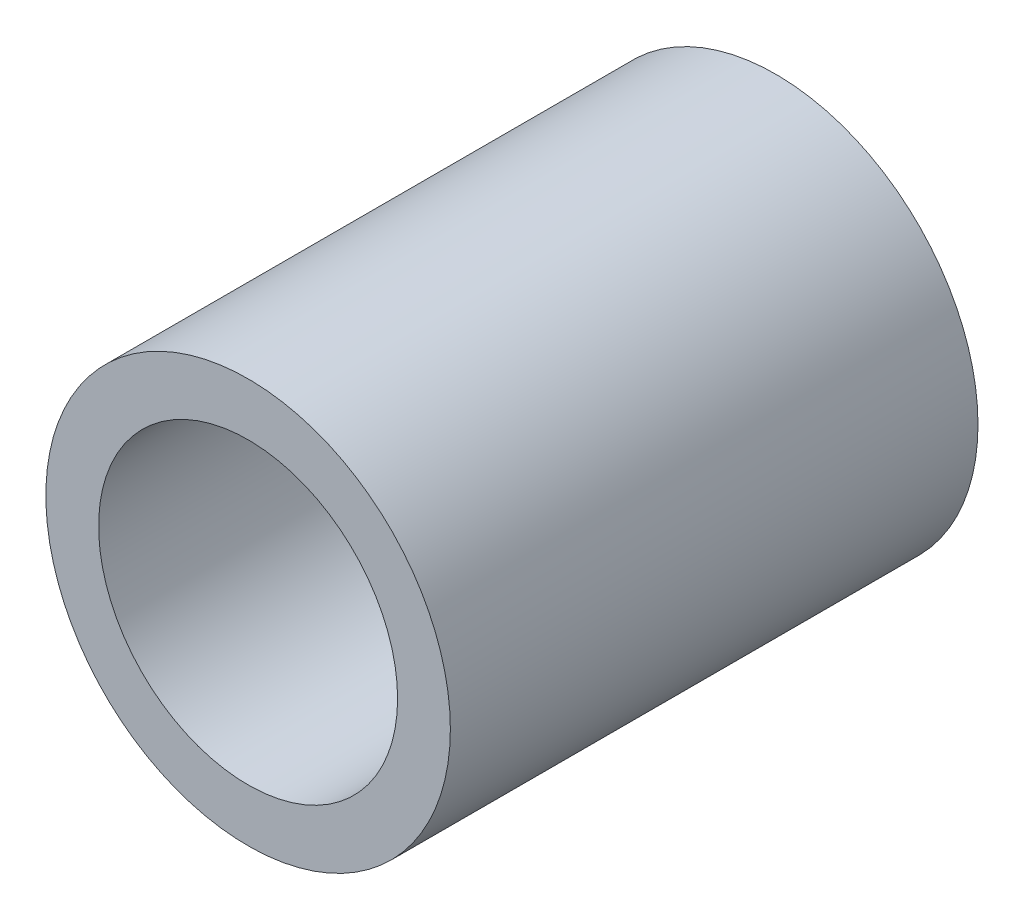
ISO-10303-21;
HEADER;
FILE_DESCRIPTION(('STEP AP214'),'2;1');
FILE_NAME('part.step','',(''),(''),'','','');
FILE_SCHEMA(('AUTOMOTIVE_DESIGN { 1 0 10303 214 1 1 1 1 }'));
ENDSEC;
DATA;
#1=APPLICATION_CONTEXT('core data for automotive mechanical design processes');
#2=APPLICATION_PROTOCOL_DEFINITION('international standard','automotive_design',2000,#1);
#3=PRODUCT_CONTEXT('',#1,'mechanical');
#4=PRODUCT('Part','Part','',(#3));
#5=PRODUCT_RELATED_PRODUCT_CATEGORY('part','',(#4));
#6=PRODUCT_DEFINITION_FORMATION('','',#4);
#7=PRODUCT_DEFINITION_CONTEXT('part definition',#1,'design');
#8=PRODUCT_DEFINITION('design','',#6,#7);
#9=PRODUCT_DEFINITION_SHAPE('','',#8);
#10=(LENGTH_UNIT() NAMED_UNIT(*) SI_UNIT(.MILLI.,.METRE.));
#11=(NAMED_UNIT(*) PLANE_ANGLE_UNIT() SI_UNIT($,.RADIAN.));
#12=(NAMED_UNIT(*) SI_UNIT($,.STERADIAN.) SOLID_ANGLE_UNIT());
#13=UNCERTAINTY_MEASURE_WITH_UNIT(LENGTH_MEASURE(1.E-05),#10,'distance_accuracy_value','');
#14=(GEOMETRIC_REPRESENTATION_CONTEXT(3) GLOBAL_UNCERTAINTY_ASSIGNED_CONTEXT((#13)) GLOBAL_UNIT_ASSIGNED_CONTEXT((#10,
#11,#12)) REPRESENTATION_CONTEXT('',''));
#15=CARTESIAN_POINT('',(0.,0.,0.));
#16=DIRECTION('',(0.,0.,1.));
#17=DIRECTION('',(1.,0.,0.));
#18=AXIS2_PLACEMENT_3D('',#15,#16,#17);
#19=CARTESIAN_POINT('',(0.,0.,9.));
#20=DIRECTION('',(0.,0.,1.));
#21=DIRECTION('',(1.,0.,0.));
#22=AXIS2_PLACEMENT_3D('',#19,#20,#21);
#23=PLANE('',#22);
#24=CARTESIAN_POINT('',(0.,0.,9.));
#25=DIRECTION('',(0.,0.,1.));
#26=DIRECTION('',(1.,0.,0.));
#27=AXIS2_PLACEMENT_3D('',#24,#25,#26);
#28=CIRCLE('',#27,3.45);
#29=CARTESIAN_POINT('',(3.45,0.,9.));
#30=VERTEX_POINT('',#29);
#31=EDGE_CURVE('E10',#30,#30,#28,.T.);
#32=ORIENTED_EDGE('',*,*,#31,.T.);
#33=EDGE_LOOP('',(#32));
#34=FACE_BOUND('',#33,.T.);
#35=CARTESIAN_POINT('',(0.,0.,9.));
#36=DIRECTION('',(0.,0.,1.));
#37=DIRECTION('',(1.,0.,0.));
#38=AXIS2_PLACEMENT_3D('',#35,#36,#37);
#39=CIRCLE('',#38,2.55);
#40=CARTESIAN_POINT('',(2.55,0.,9.));
#41=VERTEX_POINT('',#40);
#42=EDGE_CURVE('E44',#41,#41,#39,.T.);
#43=ORIENTED_EDGE('',*,*,#42,.F.);
#44=EDGE_LOOP('',(#43));
#45=FACE_BOUND('',#44,.T.);
#46=ADVANCED_FACE('F33',(#34,#45),#23,.T.);
#47=CARTESIAN_POINT('',(0.,0.,0.));
#48=DIRECTION('',(0.,0.,1.));
#49=DIRECTION('',(1.,0.,0.));
#50=AXIS2_PLACEMENT_3D('',#47,#48,#49);
#51=PLANE('',#50);
#52=CARTESIAN_POINT('',(0.,0.,0.));
#53=DIRECTION('',(0.,0.,1.));
#54=DIRECTION('',(1.,0.,0.));
#55=AXIS2_PLACEMENT_3D('',#52,#53,#54);
#56=CIRCLE('',#55,3.45);
#57=CARTESIAN_POINT('',(3.45,0.,0.));
#58=VERTEX_POINT('',#57);
#59=EDGE_CURVE('E37',#58,#58,#56,.T.);
#60=ORIENTED_EDGE('',*,*,#59,.F.);
#61=EDGE_LOOP('',(#60));
#62=FACE_BOUND('',#61,.T.);
#63=CARTESIAN_POINT('',(0.,0.,0.));
#64=DIRECTION('',(0.,0.,1.));
#65=DIRECTION('',(1.,0.,0.));
#66=AXIS2_PLACEMENT_3D('',#63,#64,#65);
#67=CIRCLE('',#66,2.55);
#68=CARTESIAN_POINT('',(2.55,0.,0.));
#69=VERTEX_POINT('',#68);
#70=EDGE_CURVE('E46',#69,#69,#67,.T.);
#71=ORIENTED_EDGE('',*,*,#70,.T.);
#72=EDGE_LOOP('',(#71));
#73=FACE_BOUND('',#72,.T.);
#74=ADVANCED_FACE('F56',(#62,#73),#51,.F.);
#75=CARTESIAN_POINT('',(0.,0.,9.));
#76=DIRECTION('',(0.,0.,-1.));
#77=DIRECTION('',(-1.,0.,0.));
#78=AXIS2_PLACEMENT_3D('',#75,#76,#77);
#79=CYLINDRICAL_SURFACE('',#78,3.45);
#80=ORIENTED_EDGE('',*,*,#31,.F.);
#81=EDGE_LOOP('',(#80));
#82=FACE_BOUND('',#81,.T.);
#83=ORIENTED_EDGE('',*,*,#59,.T.);
#84=EDGE_LOOP('',(#83));
#85=FACE_BOUND('',#84,.T.);
#86=ADVANCED_FACE('F35',(#82,#85),#79,.T.);
#87=CARTESIAN_POINT('',(0.,0.,9.));
#88=DIRECTION('',(0.,0.,-1.));
#89=DIRECTION('',(-1.,0.,0.));
#90=AXIS2_PLACEMENT_3D('',#87,#88,#89);
#91=CYLINDRICAL_SURFACE('',#90,2.55);
#92=ORIENTED_EDGE('',*,*,#42,.T.);
#93=EDGE_LOOP('',(#92));
#94=FACE_BOUND('',#93,.T.);
#95=ORIENTED_EDGE('',*,*,#70,.F.);
#96=EDGE_LOOP('',(#95));
#97=FACE_BOUND('',#96,.T.);
#98=ADVANCED_FACE('F52',(#94,#97),#91,.F.);
#99=CLOSED_SHELL('',(#46,#74,#86,#98));
#100=MANIFOLD_SOLID_BREP('B2',#99);
#101=ADVANCED_BREP_SHAPE_REPRESENTATION('',(#18,#100),#14);
#102=SHAPE_DEFINITION_REPRESENTATION(#9,#101);
ENDSEC;
END-ISO-10303-21;
